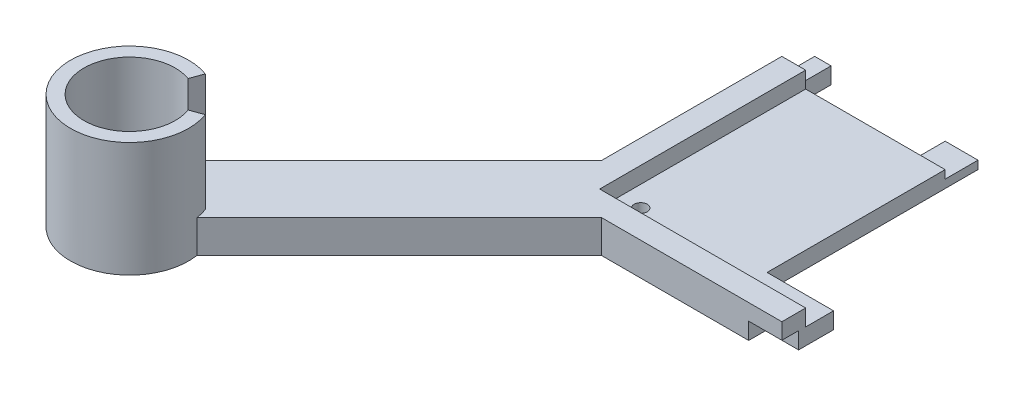
ISO-10303-21;
HEADER;
FILE_DESCRIPTION(('STEP AP214'),'2;1');
FILE_NAME('part.step','',(''),(''),'','','');
FILE_SCHEMA(('AUTOMOTIVE_DESIGN { 1 0 10303 214 1 1 1 1 }'));
ENDSEC;
DATA;
#1=APPLICATION_CONTEXT('core data for automotive mechanical design processes');
#2=APPLICATION_PROTOCOL_DEFINITION('international standard','automotive_design',2000,#1);
#3=PRODUCT_CONTEXT('',#1,'mechanical');
#4=PRODUCT('Part','Part','',(#3));
#5=PRODUCT_RELATED_PRODUCT_CATEGORY('part','',(#4));
#6=PRODUCT_DEFINITION_FORMATION('','',#4);
#7=PRODUCT_DEFINITION_CONTEXT('part definition',#1,'design');
#8=PRODUCT_DEFINITION('design','',#6,#7);
#9=PRODUCT_DEFINITION_SHAPE('','',#8);
#10=(LENGTH_UNIT() NAMED_UNIT(*) SI_UNIT(.MILLI.,.METRE.));
#11=(NAMED_UNIT(*) PLANE_ANGLE_UNIT() SI_UNIT($,.RADIAN.));
#12=(NAMED_UNIT(*) SI_UNIT($,.STERADIAN.) SOLID_ANGLE_UNIT());
#13=UNCERTAINTY_MEASURE_WITH_UNIT(LENGTH_MEASURE(1.E-05),#10,'distance_accuracy_value','');
#14=(GEOMETRIC_REPRESENTATION_CONTEXT(3) GLOBAL_UNCERTAINTY_ASSIGNED_CONTEXT((#13)) GLOBAL_UNIT_ASSIGNED_CONTEXT((#10,
#11,#12)) REPRESENTATION_CONTEXT('',''));
#15=CARTESIAN_POINT('',(0.,0.,0.));
#16=DIRECTION('',(0.,0.,1.));
#17=DIRECTION('',(1.,0.,0.));
#18=AXIS2_PLACEMENT_3D('',#15,#16,#17);
#19=CARTESIAN_POINT('',(-210.827922049848,-10.01,0.));
#20=DIRECTION('',(0.,0.,1.));
#21=DIRECTION('',(1.,0.,0.));
#22=AXIS2_PLACEMENT_3D('',#19,#20,#21);
#23=PLANE('',#22);
#24=DIRECTION('',(0.,1.,0.));
#25=VECTOR('',#24,1.);
#26=CARTESIAN_POINT('',(-30.25,-10.,0.));
#27=LINE('',#26,#25);
#28=CARTESIAN_POINT('',(-30.25,-10.,0.));
#29=VERTEX_POINT('',#28);
#30=CARTESIAN_POINT('',(-30.25,-7.5,0.));
#31=VERTEX_POINT('',#30);
#32=EDGE_CURVE('E258',#29,#31,#27,.T.);
#33=ORIENTED_EDGE('',*,*,#32,.F.);
#34=DIRECTION('',(1.,0.,0.));
#35=VECTOR('',#34,1.);
#36=CARTESIAN_POINT('',(134.350288425444,-10.,0.));
#37=LINE('',#36,#35);
#38=CARTESIAN_POINT('',(-65.,-10.,0.));
#39=VERTEX_POINT('',#38);
#40=EDGE_CURVE('E67',#39,#29,#37,.T.);
#41=ORIENTED_EDGE('',*,*,#40,.F.);
#42=DIRECTION('',(0.,-1.,0.));
#43=VECTOR('',#42,1.);
#44=CARTESIAN_POINT('',(-65.,-10.,0.));
#45=LINE('',#44,#43);
#46=CARTESIAN_POINT('',(-65.,-5.,0.));
#47=VERTEX_POINT('',#46);
#48=EDGE_CURVE('E279',#47,#39,#45,.T.);
#49=ORIENTED_EDGE('',*,*,#48,.F.);
#50=DIRECTION('',(1.,0.,0.));
#51=VECTOR('',#50,1.);
#52=CARTESIAN_POINT('',(-70.,-5.,0.));
#53=LINE('',#52,#51);
#54=CARTESIAN_POINT('',(-70.,-5.,0.));
#55=VERTEX_POINT('',#54);
#56=EDGE_CURVE('E273',#55,#47,#53,.T.);
#57=ORIENTED_EDGE('',*,*,#56,.F.);
#58=DIRECTION('',(0.,1.,0.));
#59=VECTOR('',#58,1.);
#60=CARTESIAN_POINT('',(-70.,-10.,0.));
#61=LINE('',#60,#59);
#62=CARTESIAN_POINT('',(-70.,0.,0.));
#63=VERTEX_POINT('',#62);
#64=EDGE_CURVE('E484',#55,#63,#61,.T.);
#65=ORIENTED_EDGE('',*,*,#64,.T.);
#66=DIRECTION('',(1.,0.,0.));
#67=VECTOR('',#66,1.);
#68=CARTESIAN_POINT('',(134.350288425444,0.,0.));
#69=LINE('',#68,#67);
#70=CARTESIAN_POINT('',(-62.75,0.,0.));
#71=VERTEX_POINT('',#70);
#72=EDGE_CURVE('E313',#63,#71,#69,.T.);
#73=ORIENTED_EDGE('',*,*,#72,.T.);
#74=DIRECTION('',(0.,1.,0.));
#75=VECTOR('',#74,1.);
#76=CARTESIAN_POINT('',(-62.75,-5.,0.));
#77=LINE('',#76,#75);
#78=CARTESIAN_POINT('',(-62.75,-5.,0.));
#79=VERTEX_POINT('',#78);
#80=EDGE_CURVE('E316',#79,#71,#77,.T.);
#81=ORIENTED_EDGE('',*,*,#80,.F.);
#82=DIRECTION('',(1.,0.,0.));
#83=VECTOR('',#82,1.);
#84=CARTESIAN_POINT('',(0.,-5.,0.));
#85=LINE('',#84,#83);
#86=CARTESIAN_POINT('',(-20.25,-5.,0.));
#87=VERTEX_POINT('',#86);
#88=EDGE_CURVE('E488',#79,#87,#85,.T.);
#89=ORIENTED_EDGE('',*,*,#88,.T.);
#90=DIRECTION('',(0.,1.,0.));
#91=VECTOR('',#90,1.);
#92=CARTESIAN_POINT('',(-20.25,-10.,0.));
#93=LINE('',#92,#91);
#94=CARTESIAN_POINT('',(-20.25,-7.5,0.));
#95=VERTEX_POINT('',#94);
#96=EDGE_CURVE('E312',#95,#87,#93,.T.);
#97=ORIENTED_EDGE('',*,*,#96,.F.);
#98=DIRECTION('',(1.,0.,0.));
#99=VECTOR('',#98,1.);
#100=CARTESIAN_POINT('',(-20.25,-7.5,0.));
#101=LINE('',#100,#99);
#102=EDGE_CURVE('E248',#31,#95,#101,.T.);
#103=ORIENTED_EDGE('',*,*,#102,.F.);
#104=EDGE_LOOP('',(#33,#41,#49,#57,#65,#73,#81,#89,#97,#103));
#105=FACE_BOUND('',#104,.T.);
#106=ADVANCED_FACE('F41',(#105),#23,.F.);
#107=CARTESIAN_POINT('',(0.,-10.01,-249.205352090915));
#108=DIRECTION('',(-1.,0.,0.));
#109=DIRECTION('',(0.,0.,1.));
#110=AXIS2_PLACEMENT_3D('',#107,#108,#109);
#111=PLANE('',#110);
#112=DIRECTION('',(0.,-1.,0.));
#113=VECTOR('',#112,1.);
#114=CARTESIAN_POINT('',(0.,-10.,70.));
#115=LINE('',#114,#113);
#116=CARTESIAN_POINT('',(0.,0.,70.));
#117=VERTEX_POINT('',#116);
#118=CARTESIAN_POINT('',(0.,-4.9,70.));
#119=VERTEX_POINT('',#118);
#120=EDGE_CURVE('E487',#117,#119,#115,.T.);
#121=ORIENTED_EDGE('',*,*,#120,.T.);
#122=DIRECTION('',(0.,0.,1.));
#123=VECTOR('',#122,1.);
#124=CARTESIAN_POINT('',(0.,-4.9,70.));
#125=LINE('',#124,#123);
#126=CARTESIAN_POINT('',(0.,-4.9,64.9));
#127=VERTEX_POINT('',#126);
#128=EDGE_CURVE('E513',#127,#119,#125,.T.);
#129=ORIENTED_EDGE('',*,*,#128,.F.);
#130=DIRECTION('',(0.,1.,0.));
#131=VECTOR('',#130,1.);
#132=CARTESIAN_POINT('',(0.,-10.,64.9));
#133=LINE('',#132,#131);
#134=CARTESIAN_POINT('',(0.,-10.,64.9));
#135=VERTEX_POINT('',#134);
#136=EDGE_CURVE('E574',#135,#127,#133,.T.);
#137=ORIENTED_EDGE('',*,*,#136,.F.);
#138=DIRECTION('',(0.,0.,1.));
#139=VECTOR('',#138,1.);
#140=CARTESIAN_POINT('',(0.,-10.,-134.350288425444));
#141=LINE('',#140,#139);
#142=CARTESIAN_POINT('',(0.,-10.,54.25));
#143=VERTEX_POINT('',#142);
#144=EDGE_CURVE('E233',#143,#135,#141,.T.);
#145=ORIENTED_EDGE('',*,*,#144,.F.);
#146=DIRECTION('',(0.,-1.,0.));
#147=VECTOR('',#146,1.);
#148=CARTESIAN_POINT('',(0.,-10.,54.25));
#149=LINE('',#148,#147);
#150=CARTESIAN_POINT('',(0.,-5.,54.25));
#151=VERTEX_POINT('',#150);
#152=EDGE_CURVE('E309',#151,#143,#149,.T.);
#153=ORIENTED_EDGE('',*,*,#152,.F.);
#154=DIRECTION('',(0.,0.,1.));
#155=VECTOR('',#154,1.);
#156=CARTESIAN_POINT('',(0.,-5.,0.));
#157=LINE('',#156,#155);
#158=CARTESIAN_POINT('',(0.,-5.,62.75));
#159=VERTEX_POINT('',#158);
#160=EDGE_CURVE('E45',#151,#159,#157,.T.);
#161=ORIENTED_EDGE('',*,*,#160,.T.);
#162=DIRECTION('',(0.,-1.,0.));
#163=VECTOR('',#162,1.);
#164=CARTESIAN_POINT('',(0.,-5.,62.75));
#165=LINE('',#164,#163);
#166=CARTESIAN_POINT('',(0.,0.,62.75));
#167=VERTEX_POINT('',#166);
#168=EDGE_CURVE('E308',#167,#159,#165,.T.);
#169=ORIENTED_EDGE('',*,*,#168,.F.);
#170=DIRECTION('',(0.,0.,1.));
#171=VECTOR('',#170,1.);
#172=CARTESIAN_POINT('',(0.,0.,-134.350288425444));
#173=LINE('',#172,#171);
#174=EDGE_CURVE('E483',#167,#117,#173,.T.);
#175=ORIENTED_EDGE('',*,*,#174,.T.);
#176=EDGE_LOOP('',(#121,#129,#137,#145,#153,#161,#169,#175));
#177=FACE_BOUND('',#176,.T.);
#178=ADVANCED_FACE('F512',(#177),#111,.F.);
#179=CARTESIAN_POINT('',(0.,25.,0.));
#180=DIRECTION('',(0.,1.,0.));
#181=DIRECTION('',(0.,0.,-1.));
#182=AXIS2_PLACEMENT_3D('',#179,#180,#181);
#183=PLANE('',#182);
#184=CARTESIAN_POINT('',(-134.350288425444,25.,134.350288425444));
#185=DIRECTION('',(0.,1.,0.));
#186=DIRECTION('',(0.,0.,-1.));
#187=AXIS2_PLACEMENT_3D('',#184,#185,#186);
#188=CIRCLE('',#187,18.);
#189=CARTESIAN_POINT('',(-128.193925845583,25.,117.435821251298));
#190=VERTEX_POINT('',#189);
#191=CARTESIAN_POINT('',(-117.435821251299,25.,128.193925845582));
#192=VERTEX_POINT('',#191);
#193=EDGE_CURVE('E433',#190,#192,#188,.T.);
#194=ORIENTED_EDGE('',*,*,#193,.T.);
#195=DIRECTION('',(0.939692620785896,0.,-0.342020143325702));
#196=VECTOR('',#195,1.);
#197=CARTESIAN_POINT('',(27.4633521059946,25.,75.4549397737433));
#198=LINE('',#197,#196);
#199=CARTESIAN_POINT('',(-121.28856099652,25.,129.596208433217));
#200=VERTEX_POINT('',#199);
#201=EDGE_CURVE('E451',#200,#192,#198,.T.);
#202=ORIENTED_EDGE('',*,*,#201,.F.);
#203=CARTESIAN_POINT('',(-134.350288425444,25.,134.350288425444));
#204=DIRECTION('',(0.,1.,0.));
#205=DIRECTION('',(0.,0.,-1.));
#206=AXIS2_PLACEMENT_3D('',#203,#204,#205);
#207=CIRCLE('',#206,13.9);
#208=CARTESIAN_POINT('',(-129.596208433218,25.,121.28856099652));
#209=VERTEX_POINT('',#208);
#210=EDGE_CURVE('E447',#209,#200,#207,.T.);
#211=ORIENTED_EDGE('',*,*,#210,.F.);
#212=DIRECTION('',(-0.342020143325664,0.,0.93969262078591));
#213=VECTOR('',#212,1.);
#214=CARTESIAN_POINT('',(-75.4549397737513,25.,-27.463352105994));
#215=LINE('',#214,#213);
#216=EDGE_CURVE('E428',#190,#209,#215,.T.);
#217=ORIENTED_EDGE('',*,*,#216,.F.);
#218=EDGE_LOOP('',(#194,#202,#211,#217));
#219=FACE_BOUND('',#218,.T.);
#220=ADVANCED_FACE('F597',(#219),#183,.T.);
#221=CARTESIAN_POINT('',(27.4633521059946,25.,75.4549397737433));
#222=DIRECTION('',(-0.342020143325702,0.,-0.939692620785896));
#223=DIRECTION('',(-0.939692620785896,0.,0.342020143325702));
#224=AXIS2_PLACEMENT_3D('',#221,#222,#223);
#225=PLANE('',#224);
#226=DIRECTION('',(0.939692620785896,0.,-0.342020143325702));
#227=VECTOR('',#226,1.);
#228=CARTESIAN_POINT('',(27.4633521059946,0.,75.4549397737433));
#229=LINE('',#228,#227);
#230=CARTESIAN_POINT('',(-121.28856099652,0.,129.596208433217));
#231=VERTEX_POINT('',#230);
#232=CARTESIAN_POINT('',(-117.435821251299,0.,128.193925845582));
#233=VERTEX_POINT('',#232);
#234=EDGE_CURVE('E436',#231,#233,#229,.T.);
#235=ORIENTED_EDGE('',*,*,#234,.F.);
#236=DIRECTION('',(0.,-1.,0.));
#237=VECTOR('',#236,1.);
#238=CARTESIAN_POINT('',(-121.28856099652,25.,129.596208433217));
#239=LINE('',#238,#237);
#240=EDGE_CURVE('E416',#200,#231,#239,.T.);
#241=ORIENTED_EDGE('',*,*,#240,.F.);
#242=ORIENTED_EDGE('',*,*,#201,.T.);
#243=DIRECTION('',(0.,-1.,0.));
#244=VECTOR('',#243,1.);
#245=CARTESIAN_POINT('',(-117.435821251299,25.,128.193925845582));
#246=LINE('',#245,#244);
#247=EDGE_CURVE('E409',#192,#233,#246,.T.);
#248=ORIENTED_EDGE('',*,*,#247,.T.);
#249=EDGE_LOOP('',(#235,#241,#242,#248));
#250=FACE_BOUND('',#249,.T.);
#251=ADVANCED_FACE('F607',(#250),#225,.T.);
#252=CARTESIAN_POINT('',(-134.350288425444,25.,134.350288425444));
#253=DIRECTION('',(0.,-1.,0.));
#254=DIRECTION('',(0.,0.,-1.));
#255=AXIS2_PLACEMENT_3D('',#252,#253,#254);
#256=CYLINDRICAL_SURFACE('',#255,13.9);
#257=CARTESIAN_POINT('',(-134.350288425444,0.,134.350288425444));
#258=DIRECTION('',(0.,1.,0.));
#259=DIRECTION('',(0.,0.,-1.));
#260=AXIS2_PLACEMENT_3D('',#257,#258,#259);
#261=CIRCLE('',#260,13.9);
#262=CARTESIAN_POINT('',(-129.596208433218,0.,121.28856099652));
#263=VERTEX_POINT('',#262);
#264=EDGE_CURVE('E432',#263,#231,#261,.T.);
#265=ORIENTED_EDGE('',*,*,#264,.F.);
#266=DIRECTION('',(0.,-1.,0.));
#267=VECTOR('',#266,1.);
#268=CARTESIAN_POINT('',(-129.596208433218,25.,121.28856099652));
#269=LINE('',#268,#267);
#270=EDGE_CURVE('E420',#209,#263,#269,.T.);
#271=ORIENTED_EDGE('',*,*,#270,.F.);
#272=ORIENTED_EDGE('',*,*,#210,.T.);
#273=ORIENTED_EDGE('',*,*,#240,.T.);
#274=EDGE_LOOP('',(#265,#271,#272,#273));
#275=FACE_BOUND('',#274,.T.);
#276=ADVANCED_FACE('F836',(#275),#256,.F.);
#277=CARTESIAN_POINT('',(-75.4549397737513,25.,-27.463352105994));
#278=DIRECTION('',(0.93969262078591,0.,0.342020143325664));
#279=DIRECTION('',(0.342020143325664,0.,-0.93969262078591));
#280=AXIS2_PLACEMENT_3D('',#277,#278,#279);
#281=PLANE('',#280);
#282=DIRECTION('',(-0.342020143325664,0.,0.93969262078591));
#283=VECTOR('',#282,1.);
#284=CARTESIAN_POINT('',(-75.4549397737513,0.,-27.463352105994));
#285=LINE('',#284,#283);
#286=CARTESIAN_POINT('',(-128.193925845583,0.,117.435821251298));
#287=VERTEX_POINT('',#286);
#288=EDGE_CURVE('E429',#287,#263,#285,.T.);
#289=ORIENTED_EDGE('',*,*,#288,.F.);
#290=DIRECTION('',(0.,-1.,0.));
#291=VECTOR('',#290,1.);
#292=CARTESIAN_POINT('',(-128.193925845583,25.,117.435821251298));
#293=LINE('',#292,#291);
#294=EDGE_CURVE('E424',#190,#287,#293,.T.);
#295=ORIENTED_EDGE('',*,*,#294,.F.);
#296=ORIENTED_EDGE('',*,*,#216,.T.);
#297=ORIENTED_EDGE('',*,*,#270,.T.);
#298=EDGE_LOOP('',(#289,#295,#296,#297));
#299=FACE_BOUND('',#298,.T.);
#300=ADVANCED_FACE('F829',(#299),#281,.T.);
#301=CARTESIAN_POINT('',(-70.,-10.,55.));
#302=DIRECTION('',(-0.707106781186548,0.,-0.707106781186547));
#303=DIRECTION('',(-0.707106781186547,0.,0.707106781186548));
#304=AXIS2_PLACEMENT_3D('',#301,#302,#303);
#305=PLANE('',#304);
#306=DIRECTION('',(-0.707106781186547,0.,0.707106781186548));
#307=VECTOR('',#306,1.);
#308=CARTESIAN_POINT('',(-70.,0.,55.));
#309=LINE('',#308,#307);
#310=CARTESIAN_POINT('',(-70.,0.,55.));
#311=VERTEX_POINT('',#310);
#312=CARTESIAN_POINT('',(-131.566806524842,0.,116.566806524842));
#313=VERTEX_POINT('',#312);
#314=EDGE_CURVE('E341',#311,#313,#309,.T.);
#315=ORIENTED_EDGE('',*,*,#314,.F.);
#316=DIRECTION('',(0.,1.,0.));
#317=VECTOR('',#316,1.);
#318=CARTESIAN_POINT('',(-70.,-10.,55.));
#319=LINE('',#318,#317);
#320=CARTESIAN_POINT('',(-70.,-10.,55.));
#321=VERTEX_POINT('',#320);
#322=EDGE_CURVE('E317',#321,#311,#319,.T.);
#323=ORIENTED_EDGE('',*,*,#322,.F.);
#324=DIRECTION('',(-0.707106781186547,0.,0.707106781186548));
#325=VECTOR('',#324,1.);
#326=CARTESIAN_POINT('',(-70.,-10.,55.));
#327=LINE('',#326,#325);
#328=CARTESIAN_POINT('',(-131.566806524842,-10.,116.566806524842));
#329=VERTEX_POINT('',#328);
#330=EDGE_CURVE('E356',#321,#329,#327,.T.);
#331=ORIENTED_EDGE('',*,*,#330,.T.);
#332=DIRECTION('',(0.,1.,0.));
#333=VECTOR('',#332,1.);
#334=CARTESIAN_POINT('',(-131.566806524842,-10.,116.566806524842));
#335=LINE('',#334,#333);
#336=EDGE_CURVE('E322',#329,#313,#335,.T.);
#337=ORIENTED_EDGE('',*,*,#336,.T.);
#338=EDGE_LOOP('',(#315,#323,#331,#337));
#339=FACE_BOUND('',#338,.T.);
#340=ADVANCED_FACE('F537',(#339),#305,.T.);
#341=CARTESIAN_POINT('',(-134.350288425444,-10.,134.350288425444));
#342=DIRECTION('',(0.,1.,0.));
#343=DIRECTION('',(0.,0.,1.));
#344=AXIS2_PLACEMENT_3D('',#341,#342,#343);
#345=CYLINDRICAL_SURFACE('',#344,18.);
#346=DIRECTION('',(0.,1.,0.));
#347=VECTOR('',#346,1.);
#348=CARTESIAN_POINT('',(-116.566806524842,-10.,131.566806524842));
#349=LINE('',#348,#347);
#350=CARTESIAN_POINT('',(-116.566806524842,-10.,131.566806524842));
#351=VERTEX_POINT('',#350);
#352=CARTESIAN_POINT('',(-116.566806524842,0.,131.566806524842));
#353=VERTEX_POINT('',#352);
#354=EDGE_CURVE('E325',#351,#353,#349,.T.);
#355=ORIENTED_EDGE('',*,*,#354,.T.);
#356=CARTESIAN_POINT('',(-134.350288425444,0.,134.350288425444));
#357=DIRECTION('',(0.,1.,0.));
#358=DIRECTION('',(0.,0.,-1.));
#359=AXIS2_PLACEMENT_3D('',#356,#357,#358);
#360=CIRCLE('',#359,18.);
#361=EDGE_CURVE('E443',#353,#233,#360,.T.);
#362=ORIENTED_EDGE('',*,*,#361,.T.);
#363=ORIENTED_EDGE('',*,*,#247,.F.);
#364=ORIENTED_EDGE('',*,*,#193,.F.);
#365=ORIENTED_EDGE('',*,*,#294,.T.);
#366=EDGE_CURVE('E439',#287,#313,#360,.T.);
#367=ORIENTED_EDGE('',*,*,#366,.T.);
#368=ORIENTED_EDGE('',*,*,#336,.F.);
#369=CARTESIAN_POINT('',(-134.350288425444,-10.,134.350288425444));
#370=DIRECTION('',(0.,1.,0.));
#371=DIRECTION('',(0.,0.,1.));
#372=AXIS2_PLACEMENT_3D('',#369,#370,#371);
#373=CIRCLE('',#372,18.);
#374=EDGE_CURVE('E352',#329,#351,#373,.T.);
#375=ORIENTED_EDGE('',*,*,#374,.T.);
#376=EDGE_LOOP('',(#355,#362,#363,#364,#365,#367,#368,#375));
#377=FACE_BOUND('',#376,.T.);
#378=ADVANCED_FACE('F530',(#377),#345,.T.);
#379=CARTESIAN_POINT('',(-55.,-10.,70.));
#380=DIRECTION('',(0.707106781186548,0.,0.707106781186547));
#381=DIRECTION('',(0.707106781186547,0.,-0.707106781186548));
#382=AXIS2_PLACEMENT_3D('',#379,#380,#381);
#383=PLANE('',#382);
#384=DIRECTION('',(0.707106781186547,0.,-0.707106781186548));
#385=VECTOR('',#384,1.);
#386=CARTESIAN_POINT('',(-55.,0.,70.));
#387=LINE('',#386,#385);
#388=CARTESIAN_POINT('',(-55.,0.,70.));
#389=VERTEX_POINT('',#388);
#390=EDGE_CURVE('E336',#353,#389,#387,.T.);
#391=ORIENTED_EDGE('',*,*,#390,.F.);
#392=ORIENTED_EDGE('',*,*,#354,.F.);
#393=DIRECTION('',(0.707106781186547,0.,-0.707106781186548));
#394=VECTOR('',#393,1.);
#395=CARTESIAN_POINT('',(-55.,-10.,70.));
#396=LINE('',#395,#394);
#397=CARTESIAN_POINT('',(-55.,-10.,70.));
#398=VERTEX_POINT('',#397);
#399=EDGE_CURVE('E348',#351,#398,#396,.T.);
#400=ORIENTED_EDGE('',*,*,#399,.T.);
#401=DIRECTION('',(0.,1.,0.));
#402=VECTOR('',#401,1.);
#403=CARTESIAN_POINT('',(-55.,-10.,70.));
#404=LINE('',#403,#402);
#405=EDGE_CURVE('E329',#398,#389,#404,.T.);
#406=ORIENTED_EDGE('',*,*,#405,.T.);
#407=EDGE_LOOP('',(#391,#392,#400,#406));
#408=FACE_BOUND('',#407,.T.);
#409=ADVANCED_FACE('F527',(#408),#383,.T.);
#410=CARTESIAN_POINT('',(-55.,-10.,70.));
#411=DIRECTION('',(0.,0.,1.));
#412=DIRECTION('',(1.,0.,0.));
#413=AXIS2_PLACEMENT_3D('',#410,#411,#412);
#414=PLANE('',#413);
#415=DIRECTION('',(1.,0.,0.));
#416=VECTOR('',#415,1.);
#417=CARTESIAN_POINT('',(-10.1,-4.9,70.));
#418=LINE('',#417,#416);
#419=CARTESIAN_POINT('',(-10.1,-4.9,70.));
#420=VERTEX_POINT('',#419);
#421=EDGE_CURVE('E238',#420,#119,#418,.T.);
#422=ORIENTED_EDGE('',*,*,#421,.T.);
#423=ORIENTED_EDGE('',*,*,#120,.F.);
#424=DIRECTION('',(1.,0.,0.));
#425=VECTOR('',#424,1.);
#426=CARTESIAN_POINT('',(-55.,0.,70.));
#427=LINE('',#426,#425);
#428=EDGE_CURVE('E332',#389,#117,#427,.T.);
#429=ORIENTED_EDGE('',*,*,#428,.F.);
#430=ORIENTED_EDGE('',*,*,#405,.F.);
#431=DIRECTION('',(1.,0.,0.));
#432=VECTOR('',#431,1.);
#433=CARTESIAN_POINT('',(-55.,-10.,70.));
#434=LINE('',#433,#432);
#435=CARTESIAN_POINT('',(-10.1,-10.,70.));
#436=VERTEX_POINT('',#435);
#437=EDGE_CURVE('E321',#398,#436,#434,.T.);
#438=ORIENTED_EDGE('',*,*,#437,.T.);
#439=DIRECTION('',(0.,-1.,0.));
#440=VECTOR('',#439,1.);
#441=CARTESIAN_POINT('',(-10.1,-10.,70.));
#442=LINE('',#441,#440);
#443=EDGE_CURVE('E59',#420,#436,#442,.T.);
#444=ORIENTED_EDGE('',*,*,#443,.F.);
#445=EDGE_LOOP('',(#422,#423,#429,#430,#438,#444));
#446=FACE_BOUND('',#445,.T.);
#447=ADVANCED_FACE('F518',(#446),#414,.T.);
#448=CARTESIAN_POINT('',(-70.,-10.,-55.));
#449=DIRECTION('',(-1.,0.,0.));
#450=DIRECTION('',(0.,0.,1.));
#451=AXIS2_PLACEMENT_3D('',#448,#449,#450);
#452=PLANE('',#451);
#453=ORIENTED_EDGE('',*,*,#64,.F.);
#454=DIRECTION('',(0.,0.,1.));
#455=VECTOR('',#454,1.);
#456=CARTESIAN_POINT('',(-70.,-5.,-10.));
#457=LINE('',#456,#455);
#458=CARTESIAN_POINT('',(-70.,-5.,-10.));
#459=VERTEX_POINT('',#458);
#460=EDGE_CURVE('E302',#459,#55,#457,.T.);
#461=ORIENTED_EDGE('',*,*,#460,.F.);
#462=DIRECTION('',(0.,1.,0.));
#463=VECTOR('',#462,1.);
#464=CARTESIAN_POINT('',(-70.,-10.,-10.));
#465=LINE('',#464,#463);
#466=CARTESIAN_POINT('',(-70.,-10.,-10.));
#467=VERTEX_POINT('',#466);
#468=EDGE_CURVE('E274',#467,#459,#465,.T.);
#469=ORIENTED_EDGE('',*,*,#468,.F.);
#470=DIRECTION('',(0.,0.,1.));
#471=VECTOR('',#470,1.);
#472=CARTESIAN_POINT('',(-70.,-10.,-55.));
#473=LINE('',#472,#471);
#474=EDGE_CURVE('E337',#467,#321,#473,.T.);
#475=ORIENTED_EDGE('',*,*,#474,.T.);
#476=ORIENTED_EDGE('',*,*,#322,.T.);
#477=DIRECTION('',(0.,0.,1.));
#478=VECTOR('',#477,1.);
#479=CARTESIAN_POINT('',(-70.,0.,-55.));
#480=LINE('',#479,#478);
#481=EDGE_CURVE('E345',#63,#311,#480,.T.);
#482=ORIENTED_EDGE('',*,*,#481,.F.);
#483=EDGE_LOOP('',(#453,#461,#469,#475,#476,#482));
#484=FACE_BOUND('',#483,.T.);
#485=ADVANCED_FACE('F541',(#484),#452,.T.);
#486=CARTESIAN_POINT('',(-56.5,-10.,56.5000000000001));
#487=DIRECTION('',(0.,1.,0.));
#488=DIRECTION('',(0.,0.,1.));
#489=AXIS2_PLACEMENT_3D('',#486,#487,#488);
#490=CYLINDRICAL_SURFACE('',#489,2.);
#491=CARTESIAN_POINT('',(-56.5,-10.,56.5000000000001));
#492=DIRECTION('',(0.,1.,0.));
#493=DIRECTION('',(0.,0.,1.));
#494=AXIS2_PLACEMENT_3D('',#491,#492,#493);
#495=CIRCLE('',#494,2.);
#496=CARTESIAN_POINT('',(-56.5,-10.,58.5000000000001));
#497=VERTEX_POINT('',#496);
#498=EDGE_CURVE('E368',#497,#497,#495,.T.);
#499=ORIENTED_EDGE('',*,*,#498,.F.);
#500=EDGE_LOOP('',(#499));
#501=FACE_BOUND('',#500,.T.);
#502=CARTESIAN_POINT('',(-56.5,-5.,56.5000000000001));
#503=DIRECTION('',(0.,1.,0.));
#504=DIRECTION('',(0.,0.,1.));
#505=AXIS2_PLACEMENT_3D('',#502,#503,#504);
#506=CIRCLE('',#505,2.);
#507=CARTESIAN_POINT('',(-56.5,-5.,58.5000000000001));
#508=VERTEX_POINT('',#507);
#509=EDGE_CURVE('E457',#508,#508,#506,.F.);
#510=ORIENTED_EDGE('',*,*,#509,.F.);
#511=EDGE_LOOP('',(#510));
#512=FACE_BOUND('',#511,.T.);
#513=ADVANCED_FACE('F622',(#501,#512),#490,.F.);
#514=CARTESIAN_POINT('',(-20.25,-10.,-54.25));
#515=DIRECTION('',(-1.,0.,0.));
#516=DIRECTION('',(0.,0.,1.));
#517=AXIS2_PLACEMENT_3D('',#514,#515,#516);
#518=PLANE('',#517);
#519=DIRECTION('',(0.,0.,1.));
#520=VECTOR('',#519,1.);
#521=CARTESIAN_POINT('',(-20.25,-10.,-54.25));
#522=LINE('',#521,#520);
#523=CARTESIAN_POINT('',(-20.25,-10.,-10.));
#524=VERTEX_POINT('',#523);
#525=CARTESIAN_POINT('',(-20.25,-10.,54.25));
#526=VERTEX_POINT('',#525);
#527=EDGE_CURVE('E367',#524,#526,#522,.T.);
#528=ORIENTED_EDGE('',*,*,#527,.F.);
#529=DIRECTION('',(0.,-1.,0.));
#530=VECTOR('',#529,1.);
#531=CARTESIAN_POINT('',(-20.25,-10.,-10.));
#532=LINE('',#531,#530);
#533=CARTESIAN_POINT('',(-20.25,-7.5,-10.));
#534=VERTEX_POINT('',#533);
#535=EDGE_CURVE('E243',#534,#524,#532,.T.);
#536=ORIENTED_EDGE('',*,*,#535,.F.);
#537=DIRECTION('',(0.,0.,1.));
#538=VECTOR('',#537,1.);
#539=CARTESIAN_POINT('',(-20.25,-7.5,-10.));
#540=LINE('',#539,#538);
#541=EDGE_CURVE('E257',#534,#95,#540,.T.);
#542=ORIENTED_EDGE('',*,*,#541,.T.);
#543=ORIENTED_EDGE('',*,*,#96,.T.);
#544=DIRECTION('',(0.,0.,-1.));
#545=VECTOR('',#544,1.);
#546=CARTESIAN_POINT('',(-20.25,-5.,-54.25));
#547=LINE('',#546,#545);
#548=CARTESIAN_POINT('',(-20.25,-5.,54.25));
#549=VERTEX_POINT('',#548);
#550=EDGE_CURVE('E462',#549,#87,#547,.T.);
#551=ORIENTED_EDGE('',*,*,#550,.F.);
#552=DIRECTION('',(0.,1.,0.));
#553=VECTOR('',#552,1.);
#554=CARTESIAN_POINT('',(-20.25,-10.,54.25));
#555=LINE('',#554,#553);
#556=EDGE_CURVE('E360',#526,#549,#555,.T.);
#557=ORIENTED_EDGE('',*,*,#556,.F.);
#558=EDGE_LOOP('',(#528,#536,#542,#543,#551,#557));
#559=FACE_BOUND('',#558,.T.);
#560=ADVANCED_FACE('F564',(#559),#518,.F.);
#561=CARTESIAN_POINT('',(-20.25,-10.,54.25));
#562=DIRECTION('',(0.,0.,1.));
#563=DIRECTION('',(1.,0.,0.));
#564=AXIS2_PLACEMENT_3D('',#561,#562,#563);
#565=PLANE('',#564);
#566=DIRECTION('',(-1.,0.,0.));
#567=VECTOR('',#566,1.);
#568=CARTESIAN_POINT('',(-20.25,-5.,54.25));
#569=LINE('',#568,#567);
#570=EDGE_CURVE('E501',#151,#549,#569,.T.);
#571=ORIENTED_EDGE('',*,*,#570,.F.);
#572=ORIENTED_EDGE('',*,*,#152,.T.);
#573=DIRECTION('',(1.,0.,0.));
#574=VECTOR('',#573,1.);
#575=CARTESIAN_POINT('',(-20.25,-10.,54.25));
#576=LINE('',#575,#574);
#577=EDGE_CURVE('E364',#526,#143,#576,.T.);
#578=ORIENTED_EDGE('',*,*,#577,.F.);
#579=ORIENTED_EDGE('',*,*,#556,.T.);
#580=EDGE_LOOP('',(#571,#572,#578,#579));
#581=FACE_BOUND('',#580,.T.);
#582=ADVANCED_FACE('F571',(#581),#565,.F.);
#583=CARTESIAN_POINT('',(-62.75,-5.,62.75));
#584=DIRECTION('',(0.,0.,1.));
#585=DIRECTION('',(1.,0.,0.));
#586=AXIS2_PLACEMENT_3D('',#583,#584,#585);
#587=PLANE('',#586);
#588=DIRECTION('',(1.,0.,0.));
#589=VECTOR('',#588,1.);
#590=CARTESIAN_POINT('',(-62.75,0.,62.75));
#591=LINE('',#590,#589);
#592=CARTESIAN_POINT('',(-62.75,0.,62.75));
#593=VERTEX_POINT('',#592);
#594=EDGE_CURVE('E51',#593,#167,#591,.T.);
#595=ORIENTED_EDGE('',*,*,#594,.T.);
#596=ORIENTED_EDGE('',*,*,#168,.T.);
#597=DIRECTION('',(1.,0.,0.));
#598=VECTOR('',#597,1.);
#599=CARTESIAN_POINT('',(-62.75,-5.,62.75));
#600=LINE('',#599,#598);
#601=CARTESIAN_POINT('',(-62.75,-5.,62.75));
#602=VERTEX_POINT('',#601);
#603=EDGE_CURVE('E466',#602,#159,#600,.T.);
#604=ORIENTED_EDGE('',*,*,#603,.F.);
#605=DIRECTION('',(0.,1.,0.));
#606=VECTOR('',#605,1.);
#607=CARTESIAN_POINT('',(-62.75,-5.,62.75));
#608=LINE('',#607,#606);
#609=EDGE_CURVE('E461',#602,#593,#608,.T.);
#610=ORIENTED_EDGE('',*,*,#609,.T.);
#611=EDGE_LOOP('',(#595,#596,#604,#610));
#612=FACE_BOUND('',#611,.T.);
#613=ADVANCED_FACE('F588',(#612),#587,.F.);
#614=CARTESIAN_POINT('',(134.350288425444,0.,-134.350288425444));
#615=DIRECTION('',(0.,1.,0.));
#616=DIRECTION('',(0.,0.,1.));
#617=AXIS2_PLACEMENT_3D('',#614,#615,#616);
#618=PLANE('',#617);
#619=ORIENTED_EDGE('',*,*,#72,.F.);
#620=ORIENTED_EDGE('',*,*,#481,.T.);
#621=ORIENTED_EDGE('',*,*,#314,.T.);
#622=ORIENTED_EDGE('',*,*,#366,.F.);
#623=ORIENTED_EDGE('',*,*,#288,.T.);
#624=ORIENTED_EDGE('',*,*,#264,.T.);
#625=ORIENTED_EDGE('',*,*,#234,.T.);
#626=ORIENTED_EDGE('',*,*,#361,.F.);
#627=ORIENTED_EDGE('',*,*,#390,.T.);
#628=ORIENTED_EDGE('',*,*,#428,.T.);
#629=ORIENTED_EDGE('',*,*,#174,.F.);
#630=ORIENTED_EDGE('',*,*,#594,.F.);
#631=DIRECTION('',(0.,0.,1.));
#632=VECTOR('',#631,1.);
#633=CARTESIAN_POINT('',(-62.75,0.,-62.75));
#634=LINE('',#633,#632);
#635=EDGE_CURVE('E11',#71,#593,#634,.T.);
#636=ORIENTED_EDGE('',*,*,#635,.F.);
#637=EDGE_LOOP('',(#619,#620,#621,#622,#623,#624,#625,#626,#627,#628,#629,#630,#636));
#638=FACE_BOUND('',#637,.T.);
#639=CARTESIAN_POINT('',(-134.350288425444,0.,134.350288425444));
#640=DIRECTION('',(0.,1.,0.));
#641=DIRECTION('',(0.,0.,1.));
#642=AXIS2_PLACEMENT_3D('',#639,#640,#641);
#643=CIRCLE('',#642,5.10000000000065);
#644=CARTESIAN_POINT('',(-134.350288425444,0.,139.450288425445));
#645=VERTEX_POINT('',#644);
#646=EDGE_CURVE('E405',#645,#645,#643,.T.);
#647=ORIENTED_EDGE('',*,*,#646,.F.);
#648=EDGE_LOOP('',(#647));
#649=FACE_BOUND('',#648,.T.);
#650=CARTESIAN_POINT('',(-134.350288425444,0.,143.850288425444));
#651=DIRECTION('',(0.,1.,0.));
#652=DIRECTION('',(0.,0.,1.));
#653=AXIS2_PLACEMENT_3D('',#650,#651,#652);
#654=CIRCLE('',#653,1.65000000000002);
#655=CARTESIAN_POINT('',(-134.350288425444,0.,145.500288425444));
#656=VERTEX_POINT('',#655);
#657=EDGE_CURVE('E397',#656,#656,#654,.T.);
#658=ORIENTED_EDGE('',*,*,#657,.F.);
#659=EDGE_LOOP('',(#658));
#660=FACE_BOUND('',#659,.T.);
#661=CARTESIAN_POINT('',(-142.350288425444,0.,134.350288425444));
#662=DIRECTION('',(0.,1.,0.));
#663=DIRECTION('',(0.,0.,1.));
#664=AXIS2_PLACEMENT_3D('',#661,#662,#663);
#665=CIRCLE('',#664,1.65000000000002);
#666=CARTESIAN_POINT('',(-142.350288425444,0.,136.000288425444));
#667=VERTEX_POINT('',#666);
#668=EDGE_CURVE('E389',#667,#667,#665,.T.);
#669=ORIENTED_EDGE('',*,*,#668,.F.);
#670=EDGE_LOOP('',(#669));
#671=FACE_BOUND('',#670,.T.);
#672=CARTESIAN_POINT('',(-126.350288425444,0.,134.350288425444));
#673=DIRECTION('',(0.,1.,0.));
#674=DIRECTION('',(0.,0.,1.));
#675=AXIS2_PLACEMENT_3D('',#672,#673,#674);
#676=CIRCLE('',#675,1.65000000000002);
#677=CARTESIAN_POINT('',(-126.350288425444,0.,136.000288425444));
#678=VERTEX_POINT('',#677);
#679=EDGE_CURVE('E381',#678,#678,#676,.T.);
#680=ORIENTED_EDGE('',*,*,#679,.F.);
#681=EDGE_LOOP('',(#680));
#682=FACE_BOUND('',#681,.T.);
#683=CARTESIAN_POINT('',(-134.350288425444,0.,124.850288425444));
#684=DIRECTION('',(0.,1.,0.));
#685=DIRECTION('',(0.,0.,1.));
#686=AXIS2_PLACEMENT_3D('',#683,#684,#685);
#687=CIRCLE('',#686,1.65000000000066);
#688=CARTESIAN_POINT('',(-134.350288425444,0.,126.500288425445));
#689=VERTEX_POINT('',#688);
#690=EDGE_CURVE('E373',#689,#689,#687,.T.);
#691=ORIENTED_EDGE('',*,*,#690,.F.);
#692=EDGE_LOOP('',(#691));
#693=FACE_BOUND('',#692,.T.);
#694=ADVANCED_FACE('F521',(#638,#649,#660,#671,#682,#693),#618,.T.);
#695=CARTESIAN_POINT('',(0.,-5.,0.));
#696=DIRECTION('',(0.,1.,0.));
#697=DIRECTION('',(0.,0.,1.));
#698=AXIS2_PLACEMENT_3D('',#695,#696,#697);
#699=PLANE('',#698);
#700=ORIENTED_EDGE('',*,*,#88,.F.);
#701=DIRECTION('',(0.,0.,1.));
#702=VECTOR('',#701,1.);
#703=CARTESIAN_POINT('',(-62.75,-5.,-62.75));
#704=LINE('',#703,#702);
#705=EDGE_CURVE('E470',#79,#602,#704,.T.);
#706=ORIENTED_EDGE('',*,*,#705,.T.);
#707=ORIENTED_EDGE('',*,*,#603,.T.);
#708=ORIENTED_EDGE('',*,*,#160,.F.);
#709=ORIENTED_EDGE('',*,*,#570,.T.);
#710=ORIENTED_EDGE('',*,*,#550,.T.);
#711=EDGE_LOOP('',(#700,#706,#707,#708,#709,#710));
#712=FACE_BOUND('',#711,.T.);
#713=ORIENTED_EDGE('',*,*,#509,.T.);
#714=EDGE_LOOP('',(#713));
#715=FACE_BOUND('',#714,.T.);
#716=ADVANCED_FACE('F583',(#712,#715),#699,.T.);
#717=CARTESIAN_POINT('',(-62.75,-5.,-62.75));
#718=DIRECTION('',(-1.,0.,0.));
#719=DIRECTION('',(0.,0.,1.));
#720=AXIS2_PLACEMENT_3D('',#717,#718,#719);
#721=PLANE('',#720);
#722=ORIENTED_EDGE('',*,*,#705,.F.);
#723=ORIENTED_EDGE('',*,*,#80,.T.);
#724=ORIENTED_EDGE('',*,*,#635,.T.);
#725=ORIENTED_EDGE('',*,*,#609,.F.);
#726=EDGE_LOOP('',(#722,#723,#724,#725));
#727=FACE_BOUND('',#726,.T.);
#728=ADVANCED_FACE('F591',(#727),#721,.F.);
#729=CARTESIAN_POINT('',(-134.350288425444,-10.,124.850288425444));
#730=DIRECTION('',(0.,1.,0.));
#731=DIRECTION('',(0.,0.,1.));
#732=AXIS2_PLACEMENT_3D('',#729,#730,#731);
#733=CYLINDRICAL_SURFACE('',#732,1.65000000000066);
#734=CARTESIAN_POINT('',(-134.350288425444,-10.,124.850288425444));
#735=DIRECTION('',(0.,1.,0.));
#736=DIRECTION('',(0.,0.,1.));
#737=AXIS2_PLACEMENT_3D('',#734,#735,#736);
#738=CIRCLE('',#737,1.65000000000066);
#739=CARTESIAN_POINT('',(-134.350288425444,-10.,126.500288425445));
#740=VERTEX_POINT('',#739);
#741=EDGE_CURVE('E372',#740,#740,#738,.T.);
#742=ORIENTED_EDGE('',*,*,#741,.F.);
#743=EDGE_LOOP('',(#742));
#744=FACE_BOUND('',#743,.T.);
#745=ORIENTED_EDGE('',*,*,#690,.T.);
#746=EDGE_LOOP('',(#745));
#747=FACE_BOUND('',#746,.T.);
#748=ADVANCED_FACE('F627',(#744,#747),#733,.F.);
#749=CARTESIAN_POINT('',(-126.350288425444,-10.,134.350288425444));
#750=DIRECTION('',(0.,1.,0.));
#751=DIRECTION('',(0.,0.,1.));
#752=AXIS2_PLACEMENT_3D('',#749,#750,#751);
#753=CYLINDRICAL_SURFACE('',#752,1.65000000000002);
#754=CARTESIAN_POINT('',(-126.350288425444,-10.,134.350288425444));
#755=DIRECTION('',(0.,1.,0.));
#756=DIRECTION('',(0.,0.,1.));
#757=AXIS2_PLACEMENT_3D('',#754,#755,#756);
#758=CIRCLE('',#757,1.65000000000002);
#759=CARTESIAN_POINT('',(-126.350288425444,-10.,136.000288425444));
#760=VERTEX_POINT('',#759);
#761=EDGE_CURVE('E377',#760,#760,#758,.T.);
#762=ORIENTED_EDGE('',*,*,#761,.F.);
#763=EDGE_LOOP('',(#762));
#764=FACE_BOUND('',#763,.T.);
#765=ORIENTED_EDGE('',*,*,#679,.T.);
#766=EDGE_LOOP('',(#765));
#767=FACE_BOUND('',#766,.T.);
#768=ADVANCED_FACE('F647',(#764,#767),#753,.F.);
#769=CARTESIAN_POINT('',(-142.350288425444,-10.,134.350288425444));
#770=DIRECTION('',(0.,1.,0.));
#771=DIRECTION('',(0.,0.,1.));
#772=AXIS2_PLACEMENT_3D('',#769,#770,#771);
#773=CYLINDRICAL_SURFACE('',#772,1.65000000000002);
#774=CARTESIAN_POINT('',(-142.350288425444,-10.,134.350288425444));
#775=DIRECTION('',(0.,1.,0.));
#776=DIRECTION('',(0.,0.,1.));
#777=AXIS2_PLACEMENT_3D('',#774,#775,#776);
#778=CIRCLE('',#777,1.65000000000002);
#779=CARTESIAN_POINT('',(-142.350288425444,-10.,136.000288425444));
#780=VERTEX_POINT('',#779);
#781=EDGE_CURVE('E385',#780,#780,#778,.T.);
#782=ORIENTED_EDGE('',*,*,#781,.F.);
#783=EDGE_LOOP('',(#782));
#784=FACE_BOUND('',#783,.T.);
#785=ORIENTED_EDGE('',*,*,#668,.T.);
#786=EDGE_LOOP('',(#785));
#787=FACE_BOUND('',#786,.T.);
#788=ADVANCED_FACE('F656',(#784,#787),#773,.F.);
#789=CARTESIAN_POINT('',(-134.350288425444,-10.,143.850288425444));
#790=DIRECTION('',(0.,1.,0.));
#791=DIRECTION('',(0.,0.,1.));
#792=AXIS2_PLACEMENT_3D('',#789,#790,#791);
#793=CYLINDRICAL_SURFACE('',#792,1.65000000000002);
#794=CARTESIAN_POINT('',(-134.350288425444,-10.,143.850288425444));
#795=DIRECTION('',(0.,1.,0.));
#796=DIRECTION('',(0.,0.,1.));
#797=AXIS2_PLACEMENT_3D('',#794,#795,#796);
#798=CIRCLE('',#797,1.65000000000002);
#799=CARTESIAN_POINT('',(-134.350288425444,-10.,145.500288425444));
#800=VERTEX_POINT('',#799);
#801=EDGE_CURVE('E393',#800,#800,#798,.T.);
#802=ORIENTED_EDGE('',*,*,#801,.F.);
#803=EDGE_LOOP('',(#802));
#804=FACE_BOUND('',#803,.T.);
#805=ORIENTED_EDGE('',*,*,#657,.T.);
#806=EDGE_LOOP('',(#805));
#807=FACE_BOUND('',#806,.T.);
#808=ADVANCED_FACE('F665',(#804,#807),#793,.F.);
#809=CARTESIAN_POINT('',(-134.350288425444,-10.,134.350288425444));
#810=DIRECTION('',(0.,1.,0.));
#811=DIRECTION('',(0.,0.,1.));
#812=AXIS2_PLACEMENT_3D('',#809,#810,#811);
#813=CYLINDRICAL_SURFACE('',#812,5.10000000000065);
#814=CARTESIAN_POINT('',(-134.350288425444,-10.,134.350288425444));
#815=DIRECTION('',(0.,1.,0.));
#816=DIRECTION('',(0.,0.,1.));
#817=AXIS2_PLACEMENT_3D('',#814,#815,#816);
#818=CIRCLE('',#817,5.10000000000065);
#819=CARTESIAN_POINT('',(-134.350288425444,-10.,139.450288425445));
#820=VERTEX_POINT('',#819);
#821=EDGE_CURVE('E401',#820,#820,#818,.T.);
#822=ORIENTED_EDGE('',*,*,#821,.F.);
#823=EDGE_LOOP('',(#822));
#824=FACE_BOUND('',#823,.T.);
#825=ORIENTED_EDGE('',*,*,#646,.T.);
#826=EDGE_LOOP('',(#825));
#827=FACE_BOUND('',#826,.T.);
#828=ADVANCED_FACE('F603',(#824,#827),#813,.F.);
#829=CARTESIAN_POINT('',(134.350288425444,-10.,-134.350288425444));
#830=DIRECTION('',(0.,1.,0.));
#831=DIRECTION('',(0.,0.,1.));
#832=AXIS2_PLACEMENT_3D('',#829,#830,#831);
#833=PLANE('',#832);
#834=ORIENTED_EDGE('',*,*,#821,.T.);
#835=EDGE_LOOP('',(#834));
#836=FACE_BOUND('',#835,.T.);
#837=ORIENTED_EDGE('',*,*,#801,.T.);
#838=EDGE_LOOP('',(#837));
#839=FACE_BOUND('',#838,.T.);
#840=ORIENTED_EDGE('',*,*,#781,.T.);
#841=EDGE_LOOP('',(#840));
#842=FACE_BOUND('',#841,.T.);
#843=ORIENTED_EDGE('',*,*,#761,.T.);
#844=EDGE_LOOP('',(#843));
#845=FACE_BOUND('',#844,.T.);
#846=ORIENTED_EDGE('',*,*,#741,.T.);
#847=EDGE_LOOP('',(#846));
#848=FACE_BOUND('',#847,.T.);
#849=ORIENTED_EDGE('',*,*,#498,.T.);
#850=EDGE_LOOP('',(#849));
#851=FACE_BOUND('',#850,.T.);
#852=ORIENTED_EDGE('',*,*,#144,.T.);
#853=DIRECTION('',(1.,0.,0.));
#854=VECTOR('',#853,1.);
#855=CARTESIAN_POINT('',(-10.1,-10.,64.9));
#856=LINE('',#855,#854);
#857=CARTESIAN_POINT('',(-10.1,-10.,64.9));
#858=VERTEX_POINT('',#857);
#859=EDGE_CURVE('E216',#858,#135,#856,.T.);
#860=ORIENTED_EDGE('',*,*,#859,.F.);
#861=DIRECTION('',(0.,0.,-1.));
#862=VECTOR('',#861,1.);
#863=CARTESIAN_POINT('',(-10.1,-10.,70.));
#864=LINE('',#863,#862);
#865=EDGE_CURVE('E222',#436,#858,#864,.T.);
#866=ORIENTED_EDGE('',*,*,#865,.F.);
#867=ORIENTED_EDGE('',*,*,#437,.F.);
#868=ORIENTED_EDGE('',*,*,#399,.F.);
#869=ORIENTED_EDGE('',*,*,#374,.F.);
#870=ORIENTED_EDGE('',*,*,#330,.F.);
#871=ORIENTED_EDGE('',*,*,#474,.F.);
#872=DIRECTION('',(-1.,0.,0.));
#873=VECTOR('',#872,1.);
#874=CARTESIAN_POINT('',(-70.,-10.,-10.));
#875=LINE('',#874,#873);
#876=CARTESIAN_POINT('',(-65.,-10.,-10.));
#877=VERTEX_POINT('',#876);
#878=EDGE_CURVE('E285',#877,#467,#875,.T.);
#879=ORIENTED_EDGE('',*,*,#878,.F.);
#880=DIRECTION('',(0.,0.,1.));
#881=VECTOR('',#880,1.);
#882=CARTESIAN_POINT('',(-65.,-10.,-10.));
#883=LINE('',#882,#881);
#884=EDGE_CURVE('E289',#877,#39,#883,.T.);
#885=ORIENTED_EDGE('',*,*,#884,.T.);
#886=ORIENTED_EDGE('',*,*,#40,.T.);
#887=DIRECTION('',(0.,0.,1.));
#888=VECTOR('',#887,1.);
#889=CARTESIAN_POINT('',(-30.25,-10.,-10.));
#890=LINE('',#889,#888);
#891=CARTESIAN_POINT('',(-30.25,-10.,-10.));
#892=VERTEX_POINT('',#891);
#893=EDGE_CURVE('E270',#892,#29,#890,.T.);
#894=ORIENTED_EDGE('',*,*,#893,.F.);
#895=DIRECTION('',(-1.,0.,0.));
#896=VECTOR('',#895,1.);
#897=CARTESIAN_POINT('',(-20.25,-10.,-10.));
#898=LINE('',#897,#896);
#899=EDGE_CURVE('E247',#524,#892,#898,.T.);
#900=ORIENTED_EDGE('',*,*,#899,.F.);
#901=ORIENTED_EDGE('',*,*,#527,.T.);
#902=ORIENTED_EDGE('',*,*,#577,.T.);
#903=EDGE_LOOP('',(#852,#860,#866,#867,#868,#869,#870,#871,#879,#885,#886,#894,#900,#901,#902));
#904=FACE_BOUND('',#903,.T.);
#905=ADVANCED_FACE('F43',(#836,#839,#842,#845,#848,#851,#904),#833,.F.);
#906=CARTESIAN_POINT('',(-70.,-5.,-10.));
#907=DIRECTION('',(0.,-1.,0.));
#908=DIRECTION('',(1.,0.,0.));
#909=AXIS2_PLACEMENT_3D('',#906,#907,#908);
#910=PLANE('',#909);
#911=ORIENTED_EDGE('',*,*,#56,.T.);
#912=DIRECTION('',(0.,0.,1.));
#913=VECTOR('',#912,1.);
#914=CARTESIAN_POINT('',(-65.,-5.,-10.));
#915=LINE('',#914,#913);
#916=CARTESIAN_POINT('',(-65.,-5.,-10.));
#917=VERTEX_POINT('',#916);
#918=EDGE_CURVE('E298',#917,#47,#915,.T.);
#919=ORIENTED_EDGE('',*,*,#918,.F.);
#920=DIRECTION('',(1.,0.,0.));
#921=VECTOR('',#920,1.);
#922=CARTESIAN_POINT('',(-70.,-5.,-10.));
#923=LINE('',#922,#921);
#924=EDGE_CURVE('E278',#459,#917,#923,.T.);
#925=ORIENTED_EDGE('',*,*,#924,.F.);
#926=ORIENTED_EDGE('',*,*,#460,.T.);
#927=EDGE_LOOP('',(#911,#919,#925,#926));
#928=FACE_BOUND('',#927,.T.);
#929=ADVANCED_FACE('F594',(#928),#910,.F.);
#930=CARTESIAN_POINT('',(-65.,-10.,-10.));
#931=DIRECTION('',(-1.,0.,0.));
#932=DIRECTION('',(0.,0.,1.));
#933=AXIS2_PLACEMENT_3D('',#930,#931,#932);
#934=PLANE('',#933);
#935=ORIENTED_EDGE('',*,*,#48,.T.);
#936=ORIENTED_EDGE('',*,*,#884,.F.);
#937=DIRECTION('',(0.,-1.,0.));
#938=VECTOR('',#937,1.);
#939=CARTESIAN_POINT('',(-65.,-10.,-10.));
#940=LINE('',#939,#938);
#941=EDGE_CURVE('E282',#917,#877,#940,.T.);
#942=ORIENTED_EDGE('',*,*,#941,.F.);
#943=ORIENTED_EDGE('',*,*,#918,.T.);
#944=EDGE_LOOP('',(#935,#936,#942,#943));
#945=FACE_BOUND('',#944,.T.);
#946=ADVANCED_FACE('F551',(#945),#934,.F.);
#947=CARTESIAN_POINT('',(0.,0.,-10.));
#948=DIRECTION('',(0.,0.,-1.));
#949=DIRECTION('',(-1.,0.,0.));
#950=AXIS2_PLACEMENT_3D('',#947,#948,#949);
#951=PLANE('',#950);
#952=ORIENTED_EDGE('',*,*,#468,.T.);
#953=ORIENTED_EDGE('',*,*,#924,.T.);
#954=ORIENTED_EDGE('',*,*,#941,.T.);
#955=ORIENTED_EDGE('',*,*,#878,.T.);
#956=EDGE_LOOP('',(#952,#953,#954,#955));
#957=FACE_BOUND('',#956,.T.);
#958=ADVANCED_FACE('F546',(#957),#951,.T.);
#959=CARTESIAN_POINT('',(-30.25,-10.,-10.));
#960=DIRECTION('',(1.,0.,0.));
#961=DIRECTION('',(0.,0.,-1.));
#962=AXIS2_PLACEMENT_3D('',#959,#960,#961);
#963=PLANE('',#962);
#964=ORIENTED_EDGE('',*,*,#32,.T.);
#965=DIRECTION('',(0.,0.,1.));
#966=VECTOR('',#965,1.);
#967=CARTESIAN_POINT('',(-30.25,-7.5,-10.));
#968=LINE('',#967,#966);
#969=CARTESIAN_POINT('',(-30.25,-7.5,-10.));
#970=VERTEX_POINT('',#969);
#971=EDGE_CURVE('E266',#970,#31,#968,.T.);
#972=ORIENTED_EDGE('',*,*,#971,.F.);
#973=DIRECTION('',(0.,1.,0.));
#974=VECTOR('',#973,1.);
#975=CARTESIAN_POINT('',(-30.25,-10.,-10.));
#976=LINE('',#975,#974);
#977=EDGE_CURVE('E251',#892,#970,#976,.T.);
#978=ORIENTED_EDGE('',*,*,#977,.F.);
#979=ORIENTED_EDGE('',*,*,#893,.T.);
#980=EDGE_LOOP('',(#964,#972,#978,#979));
#981=FACE_BOUND('',#980,.T.);
#982=ADVANCED_FACE('F557',(#981),#963,.F.);
#983=CARTESIAN_POINT('',(-20.25,-7.5,-10.));
#984=DIRECTION('',(0.,-1.,0.));
#985=DIRECTION('',(0.,0.,-1.));
#986=AXIS2_PLACEMENT_3D('',#983,#984,#985);
#987=PLANE('',#986);
#988=ORIENTED_EDGE('',*,*,#102,.T.);
#989=ORIENTED_EDGE('',*,*,#541,.F.);
#990=DIRECTION('',(1.,0.,0.));
#991=VECTOR('',#990,1.);
#992=CARTESIAN_POINT('',(-20.25,-7.5,-10.));
#993=LINE('',#992,#991);
#994=EDGE_CURVE('E254',#970,#534,#993,.T.);
#995=ORIENTED_EDGE('',*,*,#994,.F.);
#996=ORIENTED_EDGE('',*,*,#971,.T.);
#997=EDGE_LOOP('',(#988,#989,#995,#996));
#998=FACE_BOUND('',#997,.T.);
#999=ADVANCED_FACE('F740',(#998),#987,.F.);
#1000=CARTESIAN_POINT('',(0.,0.,-10.));
#1001=DIRECTION('',(0.,0.,1.));
#1002=DIRECTION('',(1.,0.,0.));
#1003=AXIS2_PLACEMENT_3D('',#1000,#1001,#1002);
#1004=PLANE('',#1003);
#1005=ORIENTED_EDGE('',*,*,#535,.T.);
#1006=ORIENTED_EDGE('',*,*,#899,.T.);
#1007=ORIENTED_EDGE('',*,*,#977,.T.);
#1008=ORIENTED_EDGE('',*,*,#994,.T.);
#1009=EDGE_LOOP('',(#1005,#1006,#1007,#1008));
#1010=FACE_BOUND('',#1009,.T.);
#1011=ADVANCED_FACE('F560',(#1010),#1004,.F.);
#1012=CARTESIAN_POINT('',(-10.1,-4.9,70.));
#1013=DIRECTION('',(0.,1.,0.));
#1014=DIRECTION('',(0.,0.,1.));
#1015=AXIS2_PLACEMENT_3D('',#1012,#1013,#1014);
#1016=PLANE('',#1015);
#1017=ORIENTED_EDGE('',*,*,#128,.T.);
#1018=ORIENTED_EDGE('',*,*,#421,.F.);
#1019=DIRECTION('',(0.,0.,1.));
#1020=VECTOR('',#1019,1.);
#1021=CARTESIAN_POINT('',(-10.1,-4.9,70.));
#1022=LINE('',#1021,#1020);
#1023=CARTESIAN_POINT('',(-10.1,-4.9,64.9));
#1024=VERTEX_POINT('',#1023);
#1025=EDGE_CURVE('E221',#1024,#420,#1022,.T.);
#1026=ORIENTED_EDGE('',*,*,#1025,.F.);
#1027=DIRECTION('',(1.,0.,0.));
#1028=VECTOR('',#1027,1.);
#1029=CARTESIAN_POINT('',(-10.1,-4.9,64.9));
#1030=LINE('',#1029,#1028);
#1031=EDGE_CURVE('E218',#1024,#127,#1030,.T.);
#1032=ORIENTED_EDGE('',*,*,#1031,.T.);
#1033=EDGE_LOOP('',(#1017,#1018,#1026,#1032));
#1034=FACE_BOUND('',#1033,.T.);
#1035=ADVANCED_FACE('F757',(#1034),#1016,.F.);
#1036=CARTESIAN_POINT('',(-10.1,-10.,64.9));
#1037=DIRECTION('',(0.,0.,-1.));
#1038=DIRECTION('',(-1.,0.,0.));
#1039=AXIS2_PLACEMENT_3D('',#1036,#1037,#1038);
#1040=PLANE('',#1039);
#1041=ORIENTED_EDGE('',*,*,#136,.T.);
#1042=ORIENTED_EDGE('',*,*,#1031,.F.);
#1043=DIRECTION('',(0.,1.,0.));
#1044=VECTOR('',#1043,1.);
#1045=CARTESIAN_POINT('',(-10.1,-10.,64.9));
#1046=LINE('',#1045,#1044);
#1047=EDGE_CURVE('E212',#858,#1024,#1046,.T.);
#1048=ORIENTED_EDGE('',*,*,#1047,.F.);
#1049=ORIENTED_EDGE('',*,*,#859,.T.);
#1050=EDGE_LOOP('',(#1041,#1042,#1048,#1049));
#1051=FACE_BOUND('',#1050,.T.);
#1052=ADVANCED_FACE('F214',(#1051),#1040,.F.);
#1053=CARTESIAN_POINT('',(-10.1,0.,0.));
#1054=DIRECTION('',(-1.,0.,0.));
#1055=DIRECTION('',(0.,0.,1.));
#1056=AXIS2_PLACEMENT_3D('',#1053,#1054,#1055);
#1057=PLANE('',#1056);
#1058=ORIENTED_EDGE('',*,*,#443,.T.);
#1059=ORIENTED_EDGE('',*,*,#865,.T.);
#1060=ORIENTED_EDGE('',*,*,#1047,.T.);
#1061=ORIENTED_EDGE('',*,*,#1025,.T.);
#1062=EDGE_LOOP('',(#1058,#1059,#1060,#1061));
#1063=FACE_BOUND('',#1062,.T.);
#1064=ADVANCED_FACE('F224',(#1063),#1057,.F.);
#1065=CLOSED_SHELL('',(#106,#178,#220,#251,#276,#300,#340,#378,#409,#447,#485,#513,#560,#582,
#613,#694,#716,#728,#748,#768,#788,#808,#828,#905,#929,#946,#958,#982,#999,#1011,#1035,#1052,#1064));
#1066=MANIFOLD_SOLID_BREP('B2',#1065);
#1067=ADVANCED_BREP_SHAPE_REPRESENTATION('',(#18,#1066),#14);
#1068=SHAPE_DEFINITION_REPRESENTATION(#9,#1067);
ENDSEC;
END-ISO-10303-21;
